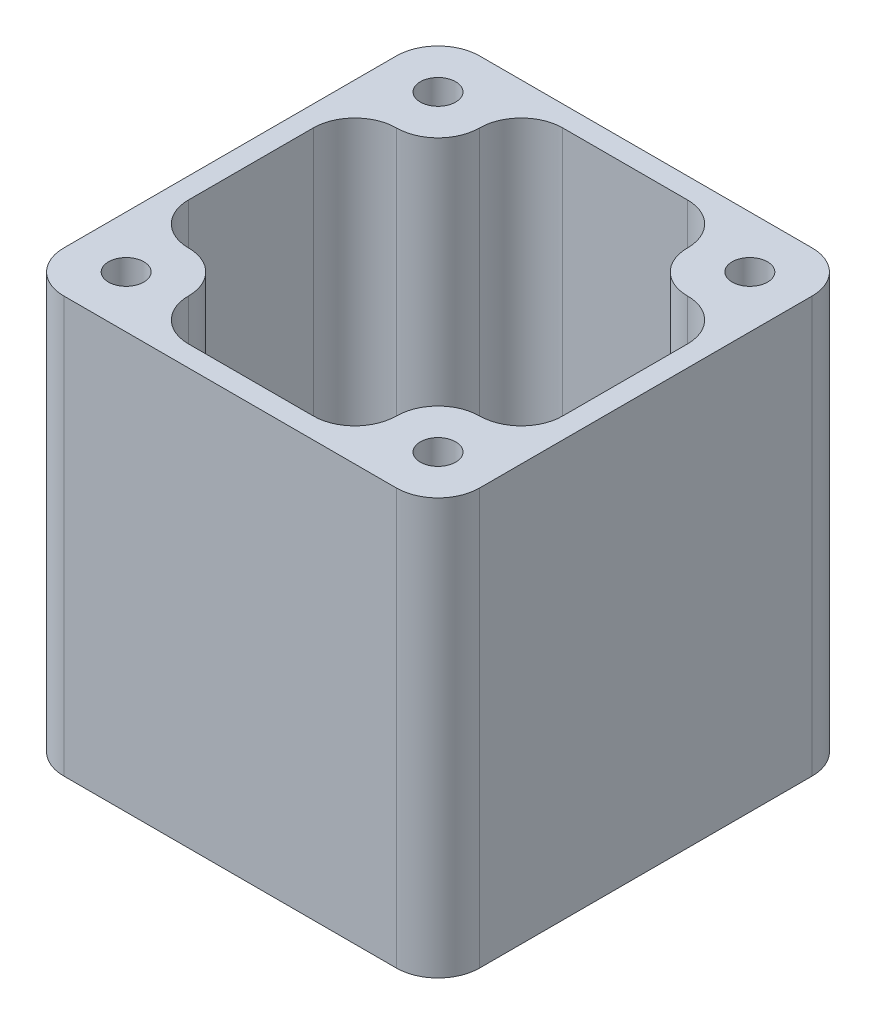
ISO-10303-21;
HEADER;
FILE_DESCRIPTION(('STEP AP214'),'2;1');
FILE_NAME('part.step','',(''),(''),'','','');
FILE_SCHEMA(('AUTOMOTIVE_DESIGN { 1 0 10303 214 1 1 1 1 }'));
ENDSEC;
DATA;
#1=APPLICATION_CONTEXT('core data for automotive mechanical design processes');
#2=APPLICATION_PROTOCOL_DEFINITION('international standard','automotive_design',2000,#1);
#3=PRODUCT_CONTEXT('',#1,'mechanical');
#4=PRODUCT('Part','Part','',(#3));
#5=PRODUCT_RELATED_PRODUCT_CATEGORY('part','',(#4));
#6=PRODUCT_DEFINITION_FORMATION('','',#4);
#7=PRODUCT_DEFINITION_CONTEXT('part definition',#1,'design');
#8=PRODUCT_DEFINITION('design','',#6,#7);
#9=PRODUCT_DEFINITION_SHAPE('','',#8);
#10=(LENGTH_UNIT() NAMED_UNIT(*) SI_UNIT(.MILLI.,.METRE.));
#11=(NAMED_UNIT(*) PLANE_ANGLE_UNIT() SI_UNIT($,.RADIAN.));
#12=(NAMED_UNIT(*) SI_UNIT($,.STERADIAN.) SOLID_ANGLE_UNIT());
#13=UNCERTAINTY_MEASURE_WITH_UNIT(LENGTH_MEASURE(1.E-05),#10,'distance_accuracy_value','');
#14=(GEOMETRIC_REPRESENTATION_CONTEXT(3) GLOBAL_UNCERTAINTY_ASSIGNED_CONTEXT((#13)) GLOBAL_UNIT_ASSIGNED_CONTEXT((#10,
#11,#12)) REPRESENTATION_CONTEXT('',''));
#15=CARTESIAN_POINT('',(0.,0.,0.));
#16=DIRECTION('',(0.,0.,1.));
#17=DIRECTION('',(1.,0.,0.));
#18=AXIS2_PLACEMENT_3D('',#15,#16,#17);
#19=CARTESIAN_POINT('',(0.,40.,0.));
#20=DIRECTION('',(0.,1.,0.));
#21=DIRECTION('',(0.,0.,1.));
#22=AXIS2_PLACEMENT_3D('',#19,#20,#21);
#23=PLANE('',#22);
#24=DIRECTION('',(1.,0.,0.));
#25=VECTOR('',#24,1.);
#26=CARTESIAN_POINT('',(-10.0000000000001,40.,18.));
#27=LINE('',#26,#25);
#28=CARTESIAN_POINT('',(-6.00000000000006,40.,18.));
#29=VERTEX_POINT('',#28);
#30=CARTESIAN_POINT('',(5.99999999999994,40.,18.));
#31=VERTEX_POINT('',#30);
#32=EDGE_CURVE('E396',#29,#31,#27,.T.);
#33=ORIENTED_EDGE('',*,*,#32,.F.);
#34=CARTESIAN_POINT('',(-6.00000000000005,40.,14.));
#35=DIRECTION('',(0.,1.,0.));
#36=DIRECTION('',(0.,0.,1.));
#37=AXIS2_PLACEMENT_3D('',#34,#35,#36);
#38=CIRCLE('',#37,4.);
#39=CARTESIAN_POINT('',(-10.,40.,14.));
#40=VERTEX_POINT('',#39);
#41=EDGE_CURVE('E372',#29,#40,#38,.F.);
#42=ORIENTED_EDGE('',*,*,#41,.T.);
#43=CARTESIAN_POINT('',(-14.,40.,14.));
#44=DIRECTION('',(0.,1.,0.));
#45=DIRECTION('',(0.,0.,1.));
#46=AXIS2_PLACEMENT_3D('',#43,#44,#45);
#47=CIRCLE('',#46,4.);
#48=CARTESIAN_POINT('',(-14.,40.,10.));
#49=VERTEX_POINT('',#48);
#50=EDGE_CURVE('E315',#40,#49,#47,.T.);
#51=ORIENTED_EDGE('',*,*,#50,.T.);
#52=CARTESIAN_POINT('',(-14.,40.,6.));
#53=DIRECTION('',(0.,1.,0.));
#54=DIRECTION('',(0.,0.,1.));
#55=AXIS2_PLACEMENT_3D('',#52,#53,#54);
#56=CIRCLE('',#55,4.);
#57=CARTESIAN_POINT('',(-18.,40.,6.));
#58=VERTEX_POINT('',#57);
#59=EDGE_CURVE('E368',#49,#58,#56,.F.);
#60=ORIENTED_EDGE('',*,*,#59,.T.);
#61=DIRECTION('',(0.,0.,1.));
#62=VECTOR('',#61,1.);
#63=CARTESIAN_POINT('',(-18.,40.,10.));
#64=LINE('',#63,#62);
#65=CARTESIAN_POINT('',(-18.,40.,-6.));
#66=VERTEX_POINT('',#65);
#67=EDGE_CURVE('E436',#66,#58,#64,.T.);
#68=ORIENTED_EDGE('',*,*,#67,.F.);
#69=CARTESIAN_POINT('',(-14.,40.,-6.));
#70=DIRECTION('',(0.,1.,0.));
#71=DIRECTION('',(0.,0.,1.));
#72=AXIS2_PLACEMENT_3D('',#69,#70,#71);
#73=CIRCLE('',#72,4.);
#74=CARTESIAN_POINT('',(-14.,40.,-10.));
#75=VERTEX_POINT('',#74);
#76=EDGE_CURVE('E102',#66,#75,#73,.F.);
#77=ORIENTED_EDGE('',*,*,#76,.T.);
#78=CARTESIAN_POINT('',(-14.,40.,-14.));
#79=DIRECTION('',(0.,1.,0.));
#80=DIRECTION('',(0.,0.,1.));
#81=AXIS2_PLACEMENT_3D('',#78,#79,#80);
#82=CIRCLE('',#81,4.);
#83=CARTESIAN_POINT('',(-9.99999999999995,40.,-14.));
#84=VERTEX_POINT('',#83);
#85=EDGE_CURVE('E309',#75,#84,#82,.T.);
#86=ORIENTED_EDGE('',*,*,#85,.T.);
#87=CARTESIAN_POINT('',(-5.99999999999995,40.,-14.));
#88=DIRECTION('',(0.,1.,0.));
#89=DIRECTION('',(0.,0.,1.));
#90=AXIS2_PLACEMENT_3D('',#87,#88,#89);
#91=CIRCLE('',#90,4.);
#92=CARTESIAN_POINT('',(-5.99999999999994,40.,-18.));
#93=VERTEX_POINT('',#92);
#94=EDGE_CURVE('E386',#84,#93,#91,.F.);
#95=ORIENTED_EDGE('',*,*,#94,.T.);
#96=DIRECTION('',(-1.,0.,0.));
#97=VECTOR('',#96,1.);
#98=CARTESIAN_POINT('',(-9.99999999999994,40.,-18.));
#99=LINE('',#98,#97);
#100=CARTESIAN_POINT('',(6.00000000000006,40.,-18.));
#101=VERTEX_POINT('',#100);
#102=EDGE_CURVE('E830',#101,#93,#99,.T.);
#103=ORIENTED_EDGE('',*,*,#102,.F.);
#104=CARTESIAN_POINT('',(6.00000000000005,40.,-14.));
#105=DIRECTION('',(0.,1.,0.));
#106=DIRECTION('',(0.,0.,1.));
#107=AXIS2_PLACEMENT_3D('',#104,#105,#106);
#108=CIRCLE('',#107,4.);
#109=CARTESIAN_POINT('',(10.,40.,-14.));
#110=VERTEX_POINT('',#109);
#111=EDGE_CURVE('E384',#101,#110,#108,.F.);
#112=ORIENTED_EDGE('',*,*,#111,.T.);
#113=CARTESIAN_POINT('',(14.,40.,-14.));
#114=DIRECTION('',(0.,1.,0.));
#115=DIRECTION('',(0.,0.,1.));
#116=AXIS2_PLACEMENT_3D('',#113,#114,#115);
#117=CIRCLE('',#116,4.);
#118=CARTESIAN_POINT('',(14.,40.,-10.));
#119=VERTEX_POINT('',#118);
#120=EDGE_CURVE('E311',#110,#119,#117,.T.);
#121=ORIENTED_EDGE('',*,*,#120,.T.);
#122=CARTESIAN_POINT('',(14.,40.,-6.));
#123=DIRECTION('',(0.,1.,0.));
#124=DIRECTION('',(0.,0.,1.));
#125=AXIS2_PLACEMENT_3D('',#122,#123,#124);
#126=CIRCLE('',#125,4.);
#127=CARTESIAN_POINT('',(18.,40.,-6.));
#128=VERTEX_POINT('',#127);
#129=EDGE_CURVE('E380',#119,#128,#126,.F.);
#130=ORIENTED_EDGE('',*,*,#129,.T.);
#131=DIRECTION('',(0.,0.,-1.));
#132=VECTOR('',#131,1.);
#133=CARTESIAN_POINT('',(18.,40.,10.));
#134=LINE('',#133,#132);
#135=CARTESIAN_POINT('',(18.,40.,6.));
#136=VERTEX_POINT('',#135);
#137=EDGE_CURVE('E440',#136,#128,#134,.T.);
#138=ORIENTED_EDGE('',*,*,#137,.F.);
#139=CARTESIAN_POINT('',(14.,40.,6.));
#140=DIRECTION('',(0.,1.,0.));
#141=DIRECTION('',(0.,0.,1.));
#142=AXIS2_PLACEMENT_3D('',#139,#140,#141);
#143=CIRCLE('',#142,4.);
#144=CARTESIAN_POINT('',(14.,40.,10.));
#145=VERTEX_POINT('',#144);
#146=EDGE_CURVE('E378',#136,#145,#143,.F.);
#147=ORIENTED_EDGE('',*,*,#146,.T.);
#148=CARTESIAN_POINT('',(14.,40.,14.));
#149=DIRECTION('',(0.,1.,0.));
#150=DIRECTION('',(0.,0.,1.));
#151=AXIS2_PLACEMENT_3D('',#148,#149,#150);
#152=CIRCLE('',#151,4.);
#153=CARTESIAN_POINT('',(9.99999999999995,40.,14.));
#154=VERTEX_POINT('',#153);
#155=EDGE_CURVE('E313',#145,#154,#152,.T.);
#156=ORIENTED_EDGE('',*,*,#155,.T.);
#157=CARTESIAN_POINT('',(5.99999999999995,40.,14.));
#158=DIRECTION('',(0.,1.,0.));
#159=DIRECTION('',(0.,0.,1.));
#160=AXIS2_PLACEMENT_3D('',#157,#158,#159);
#161=CIRCLE('',#160,4.);
#162=EDGE_CURVE('E374',#154,#31,#161,.F.);
#163=ORIENTED_EDGE('',*,*,#162,.T.);
#164=EDGE_LOOP('',(#33,#42,#51,#60,#68,#77,#86,#95,#103,#112,#121,#130,#138,#147,#156,#163));
#165=FACE_BOUND('',#164,.T.);
#166=CARTESIAN_POINT('',(-15.,40.,15.));
#167=DIRECTION('',(0.,1.,0.));
#168=DIRECTION('',(0.,0.,1.));
#169=AXIS2_PLACEMENT_3D('',#166,#167,#168);
#170=CIRCLE('',#169,1.7);
#171=CARTESIAN_POINT('',(-15.,40.,16.7));
#172=VERTEX_POINT('',#171);
#173=EDGE_CURVE('E448',#172,#172,#170,.T.);
#174=ORIENTED_EDGE('',*,*,#173,.F.);
#175=EDGE_LOOP('',(#174));
#176=FACE_BOUND('',#175,.T.);
#177=CARTESIAN_POINT('',(-15.,40.,-15.));
#178=DIRECTION('',(0.,1.,0.));
#179=DIRECTION('',(0.,0.,1.));
#180=AXIS2_PLACEMENT_3D('',#177,#178,#179);
#181=CIRCLE('',#180,1.7);
#182=CARTESIAN_POINT('',(-15.,40.,-13.3));
#183=VERTEX_POINT('',#182);
#184=EDGE_CURVE('E285',#183,#183,#181,.T.);
#185=ORIENTED_EDGE('',*,*,#184,.F.);
#186=EDGE_LOOP('',(#185));
#187=FACE_BOUND('',#186,.T.);
#188=DIRECTION('',(1.,0.,0.));
#189=VECTOR('',#188,1.);
#190=CARTESIAN_POINT('',(-20.,40.,-20.));
#191=LINE('',#190,#189);
#192=CARTESIAN_POINT('',(-16.,40.,-20.));
#193=VERTEX_POINT('',#192);
#194=CARTESIAN_POINT('',(16.,40.,-20.));
#195=VERTEX_POINT('',#194);
#196=EDGE_CURVE('E294',#193,#195,#191,.T.);
#197=ORIENTED_EDGE('',*,*,#196,.F.);
#198=CARTESIAN_POINT('',(-16.,40.,-16.));
#199=DIRECTION('',(0.,1.,0.));
#200=DIRECTION('',(0.,0.,1.));
#201=AXIS2_PLACEMENT_3D('',#198,#199,#200);
#202=CIRCLE('',#201,4.);
#203=CARTESIAN_POINT('',(-20.,40.,-16.));
#204=VERTEX_POINT('',#203);
#205=EDGE_CURVE('E323',#193,#204,#202,.T.);
#206=ORIENTED_EDGE('',*,*,#205,.T.);
#207=DIRECTION('',(0.,0.,1.));
#208=VECTOR('',#207,1.);
#209=CARTESIAN_POINT('',(-20.,40.,-20.));
#210=LINE('',#209,#208);
#211=CARTESIAN_POINT('',(-20.,40.,16.));
#212=VERTEX_POINT('',#211);
#213=EDGE_CURVE('E277',#204,#212,#210,.T.);
#214=ORIENTED_EDGE('',*,*,#213,.T.);
#215=CARTESIAN_POINT('',(-16.,40.,16.));
#216=DIRECTION('',(0.,1.,0.));
#217=DIRECTION('',(0.,0.,1.));
#218=AXIS2_PLACEMENT_3D('',#215,#216,#217);
#219=CIRCLE('',#218,4.);
#220=CARTESIAN_POINT('',(-16.,40.,20.));
#221=VERTEX_POINT('',#220);
#222=EDGE_CURVE('E317',#212,#221,#219,.T.);
#223=ORIENTED_EDGE('',*,*,#222,.T.);
#224=DIRECTION('',(1.,0.,0.));
#225=VECTOR('',#224,1.);
#226=CARTESIAN_POINT('',(-20.,40.,20.));
#227=LINE('',#226,#225);
#228=CARTESIAN_POINT('',(16.,40.,20.));
#229=VERTEX_POINT('',#228);
#230=EDGE_CURVE('E462',#221,#229,#227,.T.);
#231=ORIENTED_EDGE('',*,*,#230,.T.);
#232=CARTESIAN_POINT('',(16.,40.,16.));
#233=DIRECTION('',(0.,1.,0.));
#234=DIRECTION('',(0.,0.,1.));
#235=AXIS2_PLACEMENT_3D('',#232,#233,#234);
#236=CIRCLE('',#235,4.);
#237=CARTESIAN_POINT('',(20.,40.,16.));
#238=VERTEX_POINT('',#237);
#239=EDGE_CURVE('E319',#229,#238,#236,.T.);
#240=ORIENTED_EDGE('',*,*,#239,.T.);
#241=DIRECTION('',(0.,0.,1.));
#242=VECTOR('',#241,1.);
#243=CARTESIAN_POINT('',(20.,40.,-20.));
#244=LINE('',#243,#242);
#245=CARTESIAN_POINT('',(20.,40.,-16.));
#246=VERTEX_POINT('',#245);
#247=EDGE_CURVE('E464',#246,#238,#244,.T.);
#248=ORIENTED_EDGE('',*,*,#247,.F.);
#249=CARTESIAN_POINT('',(16.,40.,-16.));
#250=DIRECTION('',(0.,1.,0.));
#251=DIRECTION('',(0.,0.,1.));
#252=AXIS2_PLACEMENT_3D('',#249,#250,#251);
#253=CIRCLE('',#252,4.);
#254=EDGE_CURVE('E321',#246,#195,#253,.T.);
#255=ORIENTED_EDGE('',*,*,#254,.T.);
#256=EDGE_LOOP('',(#197,#206,#214,#223,#231,#240,#248,#255));
#257=FACE_BOUND('',#256,.T.);
#258=CARTESIAN_POINT('',(15.,40.,-15.));
#259=DIRECTION('',(0.,1.,0.));
#260=DIRECTION('',(0.,0.,1.));
#261=AXIS2_PLACEMENT_3D('',#258,#259,#260);
#262=CIRCLE('',#261,1.7);
#263=CARTESIAN_POINT('',(15.,40.,-13.3));
#264=VERTEX_POINT('',#263);
#265=EDGE_CURVE('E454',#264,#264,#262,.T.);
#266=ORIENTED_EDGE('',*,*,#265,.F.);
#267=EDGE_LOOP('',(#266));
#268=FACE_BOUND('',#267,.T.);
#269=CARTESIAN_POINT('',(15.,40.,15.));
#270=DIRECTION('',(0.,1.,0.));
#271=DIRECTION('',(0.,0.,1.));
#272=AXIS2_PLACEMENT_3D('',#269,#270,#271);
#273=CIRCLE('',#272,1.7);
#274=CARTESIAN_POINT('',(15.,40.,16.7));
#275=VERTEX_POINT('',#274);
#276=EDGE_CURVE('E434',#275,#275,#273,.T.);
#277=ORIENTED_EDGE('',*,*,#276,.F.);
#278=EDGE_LOOP('',(#277));
#279=FACE_BOUND('',#278,.T.);
#280=ADVANCED_FACE('F93',(#165,#176,#187,#257,#268,#279),#23,.T.);
#281=CARTESIAN_POINT('',(0.,0.,0.));
#282=DIRECTION('',(0.,1.,0.));
#283=DIRECTION('',(0.,0.,1.));
#284=AXIS2_PLACEMENT_3D('',#281,#282,#283);
#285=PLANE('',#284);
#286=DIRECTION('',(0.,0.,1.));
#287=VECTOR('',#286,1.);
#288=CARTESIAN_POINT('',(-20.,0.,-20.));
#289=LINE('',#288,#287);
#290=CARTESIAN_POINT('',(-20.,0.,-16.));
#291=VERTEX_POINT('',#290);
#292=CARTESIAN_POINT('',(-20.,0.,16.));
#293=VERTEX_POINT('',#292);
#294=EDGE_CURVE('E274',#291,#293,#289,.T.);
#295=ORIENTED_EDGE('',*,*,#294,.F.);
#296=CARTESIAN_POINT('',(-16.,0.,-16.));
#297=DIRECTION('',(0.,1.,0.));
#298=DIRECTION('',(0.,0.,1.));
#299=AXIS2_PLACEMENT_3D('',#296,#297,#298);
#300=CIRCLE('',#299,4.);
#301=CARTESIAN_POINT('',(-16.,0.,-20.));
#302=VERTEX_POINT('',#301);
#303=EDGE_CURVE('E257',#291,#302,#300,.F.);
#304=ORIENTED_EDGE('',*,*,#303,.T.);
#305=DIRECTION('',(1.,0.,0.));
#306=VECTOR('',#305,1.);
#307=CARTESIAN_POINT('',(-20.,0.,-20.));
#308=LINE('',#307,#306);
#309=CARTESIAN_POINT('',(16.,0.,-20.));
#310=VERTEX_POINT('',#309);
#311=EDGE_CURVE('E299',#302,#310,#308,.T.);
#312=ORIENTED_EDGE('',*,*,#311,.T.);
#313=CARTESIAN_POINT('',(16.,0.,-16.));
#314=DIRECTION('',(0.,1.,0.));
#315=DIRECTION('',(0.,0.,1.));
#316=AXIS2_PLACEMENT_3D('',#313,#314,#315);
#317=CIRCLE('',#316,4.);
#318=CARTESIAN_POINT('',(20.,0.,-16.));
#319=VERTEX_POINT('',#318);
#320=EDGE_CURVE('E268',#310,#319,#317,.F.);
#321=ORIENTED_EDGE('',*,*,#320,.T.);
#322=DIRECTION('',(0.,0.,1.));
#323=VECTOR('',#322,1.);
#324=CARTESIAN_POINT('',(20.,0.,-20.));
#325=LINE('',#324,#323);
#326=CARTESIAN_POINT('',(20.,0.,16.));
#327=VERTEX_POINT('',#326);
#328=EDGE_CURVE('E288',#319,#327,#325,.T.);
#329=ORIENTED_EDGE('',*,*,#328,.T.);
#330=CARTESIAN_POINT('',(16.,0.,16.));
#331=DIRECTION('',(0.,1.,0.));
#332=DIRECTION('',(0.,0.,1.));
#333=AXIS2_PLACEMENT_3D('',#330,#331,#332);
#334=CIRCLE('',#333,4.);
#335=CARTESIAN_POINT('',(16.,0.,20.));
#336=VERTEX_POINT('',#335);
#337=EDGE_CURVE('E303',#327,#336,#334,.F.);
#338=ORIENTED_EDGE('',*,*,#337,.T.);
#339=DIRECTION('',(1.,0.,0.));
#340=VECTOR('',#339,1.);
#341=CARTESIAN_POINT('',(-20.,0.,20.));
#342=LINE('',#341,#340);
#343=CARTESIAN_POINT('',(-16.,0.,20.));
#344=VERTEX_POINT('',#343);
#345=EDGE_CURVE('E284',#344,#336,#342,.T.);
#346=ORIENTED_EDGE('',*,*,#345,.F.);
#347=CARTESIAN_POINT('',(-16.,0.,16.));
#348=DIRECTION('',(0.,1.,0.));
#349=DIRECTION('',(0.,0.,1.));
#350=AXIS2_PLACEMENT_3D('',#347,#348,#349);
#351=CIRCLE('',#350,4.);
#352=EDGE_CURVE('E278',#344,#293,#351,.F.);
#353=ORIENTED_EDGE('',*,*,#352,.T.);
#354=EDGE_LOOP('',(#295,#304,#312,#321,#329,#338,#346,#353));
#355=FACE_BOUND('',#354,.T.);
#356=CARTESIAN_POINT('',(-15.,0.,-15.));
#357=DIRECTION('',(0.,1.,0.));
#358=DIRECTION('',(0.,0.,1.));
#359=AXIS2_PLACEMENT_3D('',#356,#357,#358);
#360=CIRCLE('',#359,1.7);
#361=CARTESIAN_POINT('',(-15.,0.,-13.3));
#362=VERTEX_POINT('',#361);
#363=EDGE_CURVE('E291',#362,#362,#360,.T.);
#364=ORIENTED_EDGE('',*,*,#363,.T.);
#365=EDGE_LOOP('',(#364));
#366=FACE_BOUND('',#365,.T.);
#367=CARTESIAN_POINT('',(15.,0.,-15.));
#368=DIRECTION('',(0.,1.,0.));
#369=DIRECTION('',(0.,0.,1.));
#370=AXIS2_PLACEMENT_3D('',#367,#368,#369);
#371=CIRCLE('',#370,1.7);
#372=CARTESIAN_POINT('',(15.,0.,-13.3));
#373=VERTEX_POINT('',#372);
#374=EDGE_CURVE('E451',#373,#373,#371,.T.);
#375=ORIENTED_EDGE('',*,*,#374,.T.);
#376=EDGE_LOOP('',(#375));
#377=FACE_BOUND('',#376,.T.);
#378=CARTESIAN_POINT('',(-15.,0.,15.));
#379=DIRECTION('',(0.,1.,0.));
#380=DIRECTION('',(0.,0.,1.));
#381=AXIS2_PLACEMENT_3D('',#378,#379,#380);
#382=CIRCLE('',#381,1.7);
#383=CARTESIAN_POINT('',(-15.,0.,16.7));
#384=VERTEX_POINT('',#383);
#385=EDGE_CURVE('E446',#384,#384,#382,.T.);
#386=ORIENTED_EDGE('',*,*,#385,.T.);
#387=EDGE_LOOP('',(#386));
#388=FACE_BOUND('',#387,.T.);
#389=CARTESIAN_POINT('',(15.,0.,15.));
#390=DIRECTION('',(0.,1.,0.));
#391=DIRECTION('',(0.,0.,1.));
#392=AXIS2_PLACEMENT_3D('',#389,#390,#391);
#393=CIRCLE('',#392,1.7);
#394=CARTESIAN_POINT('',(15.,0.,16.7));
#395=VERTEX_POINT('',#394);
#396=EDGE_CURVE('E430',#395,#395,#393,.T.);
#397=ORIENTED_EDGE('',*,*,#396,.T.);
#398=EDGE_LOOP('',(#397));
#399=FACE_BOUND('',#398,.T.);
#400=ADVANCED_FACE('F281',(#355,#366,#377,#388,#399),#285,.F.);
#401=CARTESIAN_POINT('',(-20.,40.,-20.));
#402=DIRECTION('',(1.,0.,0.));
#403=DIRECTION('',(0.,0.,-1.));
#404=AXIS2_PLACEMENT_3D('',#401,#402,#403);
#405=PLANE('',#404);
#406=ORIENTED_EDGE('',*,*,#213,.F.);
#407=DIRECTION('',(0.,-1.,0.));
#408=VECTOR('',#407,1.);
#409=CARTESIAN_POINT('',(-20.,0.,-16.));
#410=LINE('',#409,#408);
#411=EDGE_CURVE('E261',#204,#291,#410,.T.);
#412=ORIENTED_EDGE('',*,*,#411,.T.);
#413=ORIENTED_EDGE('',*,*,#294,.T.);
#414=DIRECTION('',(0.,-1.,0.));
#415=VECTOR('',#414,1.);
#416=CARTESIAN_POINT('',(-20.,40.,16.));
#417=LINE('',#416,#415);
#418=EDGE_CURVE('E279',#293,#212,#417,.F.);
#419=ORIENTED_EDGE('',*,*,#418,.T.);
#420=EDGE_LOOP('',(#406,#412,#413,#419));
#421=FACE_BOUND('',#420,.T.);
#422=ADVANCED_FACE('F273',(#421),#405,.F.);
#423=CARTESIAN_POINT('',(-20.,40.,20.));
#424=DIRECTION('',(0.,0.,-1.));
#425=DIRECTION('',(-1.,0.,0.));
#426=AXIS2_PLACEMENT_3D('',#423,#424,#425);
#427=PLANE('',#426);
#428=ORIENTED_EDGE('',*,*,#345,.T.);
#429=DIRECTION('',(0.,-1.,0.));
#430=VECTOR('',#429,1.);
#431=CARTESIAN_POINT('',(16.,40.,20.));
#432=LINE('',#431,#430);
#433=EDGE_CURVE('E333',#336,#229,#432,.F.);
#434=ORIENTED_EDGE('',*,*,#433,.T.);
#435=ORIENTED_EDGE('',*,*,#230,.F.);
#436=DIRECTION('',(0.,-1.,0.));
#437=VECTOR('',#436,1.);
#438=CARTESIAN_POINT('',(-16.,40.,20.));
#439=LINE('',#438,#437);
#440=EDGE_CURVE('E330',#221,#344,#439,.T.);
#441=ORIENTED_EDGE('',*,*,#440,.T.);
#442=EDGE_LOOP('',(#428,#434,#435,#441));
#443=FACE_BOUND('',#442,.T.);
#444=ADVANCED_FACE('F486',(#443),#427,.F.);
#445=CARTESIAN_POINT('',(20.,40.,-20.));
#446=DIRECTION('',(1.,0.,0.));
#447=DIRECTION('',(0.,0.,-1.));
#448=AXIS2_PLACEMENT_3D('',#445,#446,#447);
#449=PLANE('',#448);
#450=ORIENTED_EDGE('',*,*,#328,.F.);
#451=DIRECTION('',(0.,-1.,0.));
#452=VECTOR('',#451,1.);
#453=CARTESIAN_POINT('',(20.,40.,-16.));
#454=LINE('',#453,#452);
#455=EDGE_CURVE('E328',#319,#246,#454,.F.);
#456=ORIENTED_EDGE('',*,*,#455,.T.);
#457=ORIENTED_EDGE('',*,*,#247,.T.);
#458=DIRECTION('',(0.,-1.,0.));
#459=VECTOR('',#458,1.);
#460=CARTESIAN_POINT('',(20.,0.,16.));
#461=LINE('',#460,#459);
#462=EDGE_CURVE('E325',#238,#327,#461,.T.);
#463=ORIENTED_EDGE('',*,*,#462,.T.);
#464=EDGE_LOOP('',(#450,#456,#457,#463));
#465=FACE_BOUND('',#464,.T.);
#466=ADVANCED_FACE('F480',(#465),#449,.T.);
#467=CARTESIAN_POINT('',(-20.,40.,-20.));
#468=DIRECTION('',(0.,0.,-1.));
#469=DIRECTION('',(-1.,0.,0.));
#470=AXIS2_PLACEMENT_3D('',#467,#468,#469);
#471=PLANE('',#470);
#472=ORIENTED_EDGE('',*,*,#311,.F.);
#473=DIRECTION('',(0.,-1.,0.));
#474=VECTOR('',#473,1.);
#475=CARTESIAN_POINT('',(-16.,40.,-20.));
#476=LINE('',#475,#474);
#477=EDGE_CURVE('E262',#302,#193,#476,.F.);
#478=ORIENTED_EDGE('',*,*,#477,.T.);
#479=ORIENTED_EDGE('',*,*,#196,.T.);
#480=DIRECTION('',(0.,-1.,0.));
#481=VECTOR('',#480,1.);
#482=CARTESIAN_POINT('',(16.,40.,-20.));
#483=LINE('',#482,#481);
#484=EDGE_CURVE('E267',#195,#310,#483,.T.);
#485=ORIENTED_EDGE('',*,*,#484,.T.);
#486=EDGE_LOOP('',(#472,#478,#479,#485));
#487=FACE_BOUND('',#486,.T.);
#488=ADVANCED_FACE('F473',(#487),#471,.T.);
#489=CARTESIAN_POINT('',(-15.,40.,-15.));
#490=DIRECTION('',(0.,-1.,0.));
#491=DIRECTION('',(0.,0.,-1.));
#492=AXIS2_PLACEMENT_3D('',#489,#490,#491);
#493=CYLINDRICAL_SURFACE('',#492,1.7);
#494=ORIENTED_EDGE('',*,*,#184,.T.);
#495=EDGE_LOOP('',(#494));
#496=FACE_BOUND('',#495,.T.);
#497=ORIENTED_EDGE('',*,*,#363,.F.);
#498=EDGE_LOOP('',(#497));
#499=FACE_BOUND('',#498,.T.);
#500=ADVANCED_FACE('F518',(#496,#499),#493,.F.);
#501=CARTESIAN_POINT('',(15.,40.,-15.));
#502=DIRECTION('',(0.,-1.,0.));
#503=DIRECTION('',(0.,0.,-1.));
#504=AXIS2_PLACEMENT_3D('',#501,#502,#503);
#505=CYLINDRICAL_SURFACE('',#504,1.7);
#506=ORIENTED_EDGE('',*,*,#265,.T.);
#507=EDGE_LOOP('',(#506));
#508=FACE_BOUND('',#507,.T.);
#509=ORIENTED_EDGE('',*,*,#374,.F.);
#510=EDGE_LOOP('',(#509));
#511=FACE_BOUND('',#510,.T.);
#512=ADVANCED_FACE('F673',(#508,#511),#505,.F.);
#513=CARTESIAN_POINT('',(-15.,40.,15.));
#514=DIRECTION('',(0.,-1.,0.));
#515=DIRECTION('',(0.,0.,-1.));
#516=AXIS2_PLACEMENT_3D('',#513,#514,#515);
#517=CYLINDRICAL_SURFACE('',#516,1.7);
#518=ORIENTED_EDGE('',*,*,#173,.T.);
#519=EDGE_LOOP('',(#518));
#520=FACE_BOUND('',#519,.T.);
#521=ORIENTED_EDGE('',*,*,#385,.F.);
#522=EDGE_LOOP('',(#521));
#523=FACE_BOUND('',#522,.T.);
#524=ADVANCED_FACE('F504',(#520,#523),#517,.F.);
#525=CARTESIAN_POINT('',(15.,40.,15.));
#526=DIRECTION('',(0.,-1.,0.));
#527=DIRECTION('',(0.,0.,-1.));
#528=AXIS2_PLACEMENT_3D('',#525,#526,#527);
#529=CYLINDRICAL_SURFACE('',#528,1.7);
#530=ORIENTED_EDGE('',*,*,#276,.T.);
#531=EDGE_LOOP('',(#530));
#532=FACE_BOUND('',#531,.T.);
#533=ORIENTED_EDGE('',*,*,#396,.F.);
#534=EDGE_LOOP('',(#533));
#535=FACE_BOUND('',#534,.T.);
#536=ADVANCED_FACE('F500',(#532,#535),#529,.F.);
#537=CARTESIAN_POINT('',(18.,2.,10.));
#538=DIRECTION('',(1.,0.,0.));
#539=DIRECTION('',(0.,0.,-1.));
#540=AXIS2_PLACEMENT_3D('',#537,#538,#539);
#541=PLANE('',#540);
#542=DIRECTION('',(0.,0.,-1.));
#543=VECTOR('',#542,1.);
#544=CARTESIAN_POINT('',(18.,2.,10.));
#545=LINE('',#544,#543);
#546=CARTESIAN_POINT('',(18.,2.,6.));
#547=VERTEX_POINT('',#546);
#548=CARTESIAN_POINT('',(18.,2.,-6.));
#549=VERTEX_POINT('',#548);
#550=EDGE_CURVE('E431',#547,#549,#545,.T.);
#551=ORIENTED_EDGE('',*,*,#550,.F.);
#552=DIRECTION('',(0.,1.,0.));
#553=VECTOR('',#552,1.);
#554=CARTESIAN_POINT('',(18.,40.,6.));
#555=LINE('',#554,#553);
#556=EDGE_CURVE('E361',#547,#136,#555,.T.);
#557=ORIENTED_EDGE('',*,*,#556,.T.);
#558=ORIENTED_EDGE('',*,*,#137,.T.);
#559=DIRECTION('',(0.,1.,0.));
#560=VECTOR('',#559,1.);
#561=CARTESIAN_POINT('',(18.,2.,-6.));
#562=LINE('',#561,#560);
#563=EDGE_CURVE('E359',#128,#549,#562,.F.);
#564=ORIENTED_EDGE('',*,*,#563,.T.);
#565=EDGE_LOOP('',(#551,#557,#558,#564));
#566=FACE_BOUND('',#565,.T.);
#567=ADVANCED_FACE('F503',(#566),#541,.F.);
#568=CARTESIAN_POINT('',(-18.,2.,10.));
#569=DIRECTION('',(-1.,0.,0.));
#570=DIRECTION('',(0.,0.,1.));
#571=AXIS2_PLACEMENT_3D('',#568,#569,#570);
#572=PLANE('',#571);
#573=ORIENTED_EDGE('',*,*,#67,.T.);
#574=DIRECTION('',(0.,1.,0.));
#575=VECTOR('',#574,1.);
#576=CARTESIAN_POINT('',(-18.,2.,6.));
#577=LINE('',#576,#575);
#578=CARTESIAN_POINT('',(-18.,2.,6.));
#579=VERTEX_POINT('',#578);
#580=EDGE_CURVE('E337',#58,#579,#577,.F.);
#581=ORIENTED_EDGE('',*,*,#580,.T.);
#582=DIRECTION('',(0.,0.,1.));
#583=VECTOR('',#582,1.);
#584=CARTESIAN_POINT('',(-18.,2.,10.));
#585=LINE('',#584,#583);
#586=CARTESIAN_POINT('',(-18.,2.,-6.));
#587=VERTEX_POINT('',#586);
#588=EDGE_CURVE('E424',#587,#579,#585,.T.);
#589=ORIENTED_EDGE('',*,*,#588,.F.);
#590=DIRECTION('',(0.,1.,0.));
#591=VECTOR('',#590,1.);
#592=CARTESIAN_POINT('',(-18.,40.,-6.));
#593=LINE('',#592,#591);
#594=EDGE_CURVE('E335',#587,#66,#593,.T.);
#595=ORIENTED_EDGE('',*,*,#594,.T.);
#596=EDGE_LOOP('',(#573,#581,#589,#595));
#597=FACE_BOUND('',#596,.T.);
#598=ADVANCED_FACE('F427',(#597),#572,.F.);
#599=CARTESIAN_POINT('',(0.,2.,0.));
#600=DIRECTION('',(0.,-1.,0.));
#601=DIRECTION('',(0.,0.,-1.));
#602=AXIS2_PLACEMENT_3D('',#599,#600,#601);
#603=PLANE('',#602);
#604=ORIENTED_EDGE('',*,*,#588,.T.);
#605=CARTESIAN_POINT('',(-14.,2.,6.));
#606=DIRECTION('',(0.,-1.,0.));
#607=DIRECTION('',(0.,0.,-1.));
#608=AXIS2_PLACEMENT_3D('',#605,#606,#607);
#609=CIRCLE('',#608,4.);
#610=CARTESIAN_POINT('',(-14.,2.,10.));
#611=VERTEX_POINT('',#610);
#612=EDGE_CURVE('E352',#579,#611,#609,.F.);
#613=ORIENTED_EDGE('',*,*,#612,.T.);
#614=CARTESIAN_POINT('',(-14.,2.,14.));
#615=DIRECTION('',(0.,-1.,0.));
#616=DIRECTION('',(0.,0.,-1.));
#617=AXIS2_PLACEMENT_3D('',#614,#615,#616);
#618=CIRCLE('',#617,4.);
#619=CARTESIAN_POINT('',(-10.,2.,14.));
#620=VERTEX_POINT('',#619);
#621=EDGE_CURVE('E370',#611,#620,#618,.T.);
#622=ORIENTED_EDGE('',*,*,#621,.T.);
#623=CARTESIAN_POINT('',(-6.00000000000005,2.,14.));
#624=DIRECTION('',(0.,-1.,0.));
#625=DIRECTION('',(0.,0.,-1.));
#626=AXIS2_PLACEMENT_3D('',#623,#624,#625);
#627=CIRCLE('',#626,4.);
#628=CARTESIAN_POINT('',(-6.00000000000006,2.,18.));
#629=VERTEX_POINT('',#628);
#630=EDGE_CURVE('E350',#620,#629,#627,.F.);
#631=ORIENTED_EDGE('',*,*,#630,.T.);
#632=DIRECTION('',(1.,0.,0.));
#633=VECTOR('',#632,1.);
#634=CARTESIAN_POINT('',(-10.0000000000001,2.,18.));
#635=LINE('',#634,#633);
#636=CARTESIAN_POINT('',(5.99999999999994,2.,18.));
#637=VERTEX_POINT('',#636);
#638=EDGE_CURVE('E832',#629,#637,#635,.T.);
#639=ORIENTED_EDGE('',*,*,#638,.T.);
#640=CARTESIAN_POINT('',(5.99999999999995,2.,14.));
#641=DIRECTION('',(0.,-1.,0.));
#642=DIRECTION('',(0.,0.,-1.));
#643=AXIS2_PLACEMENT_3D('',#640,#641,#642);
#644=CIRCLE('',#643,4.);
#645=CARTESIAN_POINT('',(9.99999999999995,2.,14.));
#646=VERTEX_POINT('',#645);
#647=EDGE_CURVE('E348',#637,#646,#644,.F.);
#648=ORIENTED_EDGE('',*,*,#647,.T.);
#649=CARTESIAN_POINT('',(14.,2.,14.));
#650=DIRECTION('',(0.,-1.,0.));
#651=DIRECTION('',(0.,0.,-1.));
#652=AXIS2_PLACEMENT_3D('',#649,#650,#651);
#653=CIRCLE('',#652,4.);
#654=CARTESIAN_POINT('',(14.,2.,10.));
#655=VERTEX_POINT('',#654);
#656=EDGE_CURVE('E376',#646,#655,#653,.T.);
#657=ORIENTED_EDGE('',*,*,#656,.T.);
#658=CARTESIAN_POINT('',(14.,2.,6.));
#659=DIRECTION('',(0.,-1.,0.));
#660=DIRECTION('',(0.,0.,-1.));
#661=AXIS2_PLACEMENT_3D('',#658,#659,#660);
#662=CIRCLE('',#661,4.);
#663=EDGE_CURVE('E118',#655,#547,#662,.F.);
#664=ORIENTED_EDGE('',*,*,#663,.T.);
#665=ORIENTED_EDGE('',*,*,#550,.T.);
#666=CARTESIAN_POINT('',(14.,2.,-6.));
#667=DIRECTION('',(0.,-1.,0.));
#668=DIRECTION('',(0.,0.,-1.));
#669=AXIS2_PLACEMENT_3D('',#666,#667,#668);
#670=CIRCLE('',#669,4.);
#671=CARTESIAN_POINT('',(14.,2.,-10.));
#672=VERTEX_POINT('',#671);
#673=EDGE_CURVE('E110',#549,#672,#670,.F.);
#674=ORIENTED_EDGE('',*,*,#673,.T.);
#675=CARTESIAN_POINT('',(14.,2.,-14.));
#676=DIRECTION('',(0.,-1.,0.));
#677=DIRECTION('',(0.,0.,-1.));
#678=AXIS2_PLACEMENT_3D('',#675,#676,#677);
#679=CIRCLE('',#678,4.);
#680=CARTESIAN_POINT('',(10.,2.,-14.));
#681=VERTEX_POINT('',#680);
#682=EDGE_CURVE('E382',#672,#681,#679,.T.);
#683=ORIENTED_EDGE('',*,*,#682,.T.);
#684=CARTESIAN_POINT('',(6.00000000000005,2.,-14.));
#685=DIRECTION('',(0.,-1.,0.));
#686=DIRECTION('',(0.,0.,-1.));
#687=AXIS2_PLACEMENT_3D('',#684,#685,#686);
#688=CIRCLE('',#687,4.);
#689=CARTESIAN_POINT('',(6.00000000000006,2.,-18.));
#690=VERTEX_POINT('',#689);
#691=EDGE_CURVE('E344',#681,#690,#688,.F.);
#692=ORIENTED_EDGE('',*,*,#691,.T.);
#693=DIRECTION('',(-1.,0.,0.));
#694=VECTOR('',#693,1.);
#695=CARTESIAN_POINT('',(-9.99999999999994,2.,-18.));
#696=LINE('',#695,#694);
#697=CARTESIAN_POINT('',(-5.99999999999994,2.,-18.));
#698=VERTEX_POINT('',#697);
#699=EDGE_CURVE('E443',#690,#698,#696,.T.);
#700=ORIENTED_EDGE('',*,*,#699,.T.);
#701=CARTESIAN_POINT('',(-5.99999999999995,2.,-14.));
#702=DIRECTION('',(0.,-1.,0.));
#703=DIRECTION('',(0.,0.,-1.));
#704=AXIS2_PLACEMENT_3D('',#701,#702,#703);
#705=CIRCLE('',#704,4.);
#706=CARTESIAN_POINT('',(-9.99999999999995,2.,-14.));
#707=VERTEX_POINT('',#706);
#708=EDGE_CURVE('E342',#698,#707,#705,.F.);
#709=ORIENTED_EDGE('',*,*,#708,.T.);
#710=CARTESIAN_POINT('',(-14.,2.,-14.));
#711=DIRECTION('',(0.,-1.,0.));
#712=DIRECTION('',(0.,0.,-1.));
#713=AXIS2_PLACEMENT_3D('',#710,#711,#712);
#714=CIRCLE('',#713,4.);
#715=CARTESIAN_POINT('',(-14.,2.,-10.));
#716=VERTEX_POINT('',#715);
#717=EDGE_CURVE('E12',#707,#716,#714,.T.);
#718=ORIENTED_EDGE('',*,*,#717,.T.);
#719=CARTESIAN_POINT('',(-14.,2.,-6.));
#720=DIRECTION('',(0.,-1.,0.));
#721=DIRECTION('',(0.,0.,-1.));
#722=AXIS2_PLACEMENT_3D('',#719,#720,#721);
#723=CIRCLE('',#722,4.);
#724=EDGE_CURVE('E340',#716,#587,#723,.F.);
#725=ORIENTED_EDGE('',*,*,#724,.T.);
#726=EDGE_LOOP('',(#604,#613,#622,#631,#639,#648,#657,#664,#665,#674,#683,#692,#700,#709,#718,#725));
#727=FACE_BOUND('',#726,.T.);
#728=ADVANCED_FACE('F423',(#727),#603,.F.);
#729=CARTESIAN_POINT('',(-9.99999999999994,2.,-18.));
#730=DIRECTION('',(0.,0.,-1.));
#731=DIRECTION('',(-1.,0.,0.));
#732=AXIS2_PLACEMENT_3D('',#729,#730,#731);
#733=PLANE('',#732);
#734=ORIENTED_EDGE('',*,*,#699,.F.);
#735=DIRECTION('',(0.,1.,0.));
#736=VECTOR('',#735,1.);
#737=CARTESIAN_POINT('',(6.00000000000006,40.,-18.));
#738=LINE('',#737,#736);
#739=EDGE_CURVE('E366',#690,#101,#738,.T.);
#740=ORIENTED_EDGE('',*,*,#739,.T.);
#741=ORIENTED_EDGE('',*,*,#102,.T.);
#742=DIRECTION('',(0.,1.,0.));
#743=VECTOR('',#742,1.);
#744=CARTESIAN_POINT('',(-5.99999999999994,2.,-18.));
#745=LINE('',#744,#743);
#746=EDGE_CURVE('E363',#93,#698,#745,.F.);
#747=ORIENTED_EDGE('',*,*,#746,.T.);
#748=EDGE_LOOP('',(#734,#740,#741,#747));
#749=FACE_BOUND('',#748,.T.);
#750=ADVANCED_FACE('F633',(#749),#733,.F.);
#751=CARTESIAN_POINT('',(-10.0000000000001,2.,18.));
#752=DIRECTION('',(0.,0.,1.));
#753=DIRECTION('',(1.,0.,0.));
#754=AXIS2_PLACEMENT_3D('',#751,#752,#753);
#755=PLANE('',#754);
#756=ORIENTED_EDGE('',*,*,#638,.F.);
#757=DIRECTION('',(0.,1.,0.));
#758=VECTOR('',#757,1.);
#759=CARTESIAN_POINT('',(-6.00000000000006,40.,18.));
#760=LINE('',#759,#758);
#761=EDGE_CURVE('E357',#629,#29,#760,.T.);
#762=ORIENTED_EDGE('',*,*,#761,.T.);
#763=ORIENTED_EDGE('',*,*,#32,.T.);
#764=DIRECTION('',(0.,1.,0.));
#765=VECTOR('',#764,1.);
#766=CARTESIAN_POINT('',(5.99999999999994,2.,18.));
#767=LINE('',#766,#765);
#768=EDGE_CURVE('E354',#31,#637,#767,.F.);
#769=ORIENTED_EDGE('',*,*,#768,.T.);
#770=EDGE_LOOP('',(#756,#762,#763,#769));
#771=FACE_BOUND('',#770,.T.);
#772=ADVANCED_FACE('F525',(#771),#755,.F.);
#773=CARTESIAN_POINT('',(-16.,40.,-16.));
#774=DIRECTION('',(0.,1.,0.));
#775=DIRECTION('',(0.,0.,1.));
#776=AXIS2_PLACEMENT_3D('',#773,#774,#775);
#777=CYLINDRICAL_SURFACE('',#776,4.);
#778=ORIENTED_EDGE('',*,*,#205,.F.);
#779=ORIENTED_EDGE('',*,*,#477,.F.);
#780=ORIENTED_EDGE('',*,*,#303,.F.);
#781=ORIENTED_EDGE('',*,*,#411,.F.);
#782=EDGE_LOOP('',(#778,#779,#780,#781));
#783=FACE_BOUND('',#782,.T.);
#784=ADVANCED_FACE('F260',(#783),#777,.T.);
#785=CARTESIAN_POINT('',(16.,40.,-16.));
#786=DIRECTION('',(0.,-1.,0.));
#787=DIRECTION('',(0.,0.,-1.));
#788=AXIS2_PLACEMENT_3D('',#785,#786,#787);
#789=CYLINDRICAL_SURFACE('',#788,4.);
#790=ORIENTED_EDGE('',*,*,#254,.F.);
#791=ORIENTED_EDGE('',*,*,#455,.F.);
#792=ORIENTED_EDGE('',*,*,#320,.F.);
#793=ORIENTED_EDGE('',*,*,#484,.F.);
#794=EDGE_LOOP('',(#790,#791,#792,#793));
#795=FACE_BOUND('',#794,.T.);
#796=ADVANCED_FACE('F477',(#795),#789,.T.);
#797=CARTESIAN_POINT('',(16.,40.,16.));
#798=DIRECTION('',(0.,1.,0.));
#799=DIRECTION('',(0.,0.,1.));
#800=AXIS2_PLACEMENT_3D('',#797,#798,#799);
#801=CYLINDRICAL_SURFACE('',#800,4.);
#802=ORIENTED_EDGE('',*,*,#239,.F.);
#803=ORIENTED_EDGE('',*,*,#433,.F.);
#804=ORIENTED_EDGE('',*,*,#337,.F.);
#805=ORIENTED_EDGE('',*,*,#462,.F.);
#806=EDGE_LOOP('',(#802,#803,#804,#805));
#807=FACE_BOUND('',#806,.T.);
#808=ADVANCED_FACE('F483',(#807),#801,.T.);
#809=CARTESIAN_POINT('',(-16.,40.,16.));
#810=DIRECTION('',(0.,-1.,0.));
#811=DIRECTION('',(0.,0.,-1.));
#812=AXIS2_PLACEMENT_3D('',#809,#810,#811);
#813=CYLINDRICAL_SURFACE('',#812,4.);
#814=ORIENTED_EDGE('',*,*,#222,.F.);
#815=ORIENTED_EDGE('',*,*,#418,.F.);
#816=ORIENTED_EDGE('',*,*,#352,.F.);
#817=ORIENTED_EDGE('',*,*,#440,.F.);
#818=EDGE_LOOP('',(#814,#815,#816,#817));
#819=FACE_BOUND('',#818,.T.);
#820=ADVANCED_FACE('F491',(#819),#813,.T.);
#821=CARTESIAN_POINT('',(-6.00000000000005,2.,14.));
#822=DIRECTION('',(0.,-1.,0.));
#823=DIRECTION('',(0.,0.,-1.));
#824=AXIS2_PLACEMENT_3D('',#821,#822,#823);
#825=CYLINDRICAL_SURFACE('',#824,4.);
#826=ORIENTED_EDGE('',*,*,#761,.F.);
#827=ORIENTED_EDGE('',*,*,#630,.F.);
#828=DIRECTION('',(0.,1.,0.));
#829=VECTOR('',#828,1.);
#830=CARTESIAN_POINT('',(-10.,2.,14.));
#831=LINE('',#830,#829);
#832=EDGE_CURVE('E392',#40,#620,#831,.F.);
#833=ORIENTED_EDGE('',*,*,#832,.F.);
#834=ORIENTED_EDGE('',*,*,#41,.F.);
#835=EDGE_LOOP('',(#826,#827,#833,#834));
#836=FACE_BOUND('',#835,.T.);
#837=ADVANCED_FACE('F532',(#836),#825,.F.);
#838=CARTESIAN_POINT('',(-14.,2.,14.));
#839=DIRECTION('',(0.,-1.,0.));
#840=DIRECTION('',(0.,0.,-1.));
#841=AXIS2_PLACEMENT_3D('',#838,#839,#840);
#842=CYLINDRICAL_SURFACE('',#841,4.);
#843=ORIENTED_EDGE('',*,*,#832,.T.);
#844=ORIENTED_EDGE('',*,*,#621,.F.);
#845=DIRECTION('',(0.,-1.,0.));
#846=VECTOR('',#845,1.);
#847=CARTESIAN_POINT('',(-14.,2.,10.));
#848=LINE('',#847,#846);
#849=EDGE_CURVE('E389',#49,#611,#848,.T.);
#850=ORIENTED_EDGE('',*,*,#849,.F.);
#851=ORIENTED_EDGE('',*,*,#50,.F.);
#852=EDGE_LOOP('',(#843,#844,#850,#851));
#853=FACE_BOUND('',#852,.T.);
#854=ADVANCED_FACE('F537',(#853),#842,.T.);
#855=CARTESIAN_POINT('',(-14.,2.,6.));
#856=DIRECTION('',(0.,-1.,0.));
#857=DIRECTION('',(0.,0.,-1.));
#858=AXIS2_PLACEMENT_3D('',#855,#856,#857);
#859=CYLINDRICAL_SURFACE('',#858,4.);
#860=ORIENTED_EDGE('',*,*,#612,.F.);
#861=ORIENTED_EDGE('',*,*,#580,.F.);
#862=ORIENTED_EDGE('',*,*,#59,.F.);
#863=ORIENTED_EDGE('',*,*,#849,.T.);
#864=EDGE_LOOP('',(#860,#861,#862,#863));
#865=FACE_BOUND('',#864,.T.);
#866=ADVANCED_FACE('F533',(#865),#859,.F.);
#867=CARTESIAN_POINT('',(14.,2.,6.));
#868=DIRECTION('',(0.,-1.,0.));
#869=DIRECTION('',(0.,0.,-1.));
#870=AXIS2_PLACEMENT_3D('',#867,#868,#869);
#871=CYLINDRICAL_SURFACE('',#870,4.);
#872=ORIENTED_EDGE('',*,*,#556,.F.);
#873=ORIENTED_EDGE('',*,*,#663,.F.);
#874=DIRECTION('',(0.,1.,0.));
#875=VECTOR('',#874,1.);
#876=CARTESIAN_POINT('',(14.,2.,10.));
#877=LINE('',#876,#875);
#878=EDGE_CURVE('E393',#145,#655,#877,.F.);
#879=ORIENTED_EDGE('',*,*,#878,.F.);
#880=ORIENTED_EDGE('',*,*,#146,.F.);
#881=EDGE_LOOP('',(#872,#873,#879,#880));
#882=FACE_BOUND('',#881,.T.);
#883=ADVANCED_FACE('F536',(#882),#871,.F.);
#884=CARTESIAN_POINT('',(14.,2.,14.));
#885=DIRECTION('',(0.,1.,0.));
#886=DIRECTION('',(0.,0.,1.));
#887=AXIS2_PLACEMENT_3D('',#884,#885,#886);
#888=CYLINDRICAL_SURFACE('',#887,4.);
#889=ORIENTED_EDGE('',*,*,#878,.T.);
#890=ORIENTED_EDGE('',*,*,#656,.F.);
#891=DIRECTION('',(0.,1.,0.));
#892=VECTOR('',#891,1.);
#893=CARTESIAN_POINT('',(9.99999999999995,2.,14.));
#894=LINE('',#893,#892);
#895=EDGE_CURVE('E397',#154,#646,#894,.F.);
#896=ORIENTED_EDGE('',*,*,#895,.F.);
#897=ORIENTED_EDGE('',*,*,#155,.F.);
#898=EDGE_LOOP('',(#889,#890,#896,#897));
#899=FACE_BOUND('',#898,.T.);
#900=ADVANCED_FACE('F549',(#899),#888,.T.);
#901=CARTESIAN_POINT('',(5.99999999999995,2.,14.));
#902=DIRECTION('',(0.,-1.,0.));
#903=DIRECTION('',(0.,0.,-1.));
#904=AXIS2_PLACEMENT_3D('',#901,#902,#903);
#905=CYLINDRICAL_SURFACE('',#904,4.);
#906=ORIENTED_EDGE('',*,*,#647,.F.);
#907=ORIENTED_EDGE('',*,*,#768,.F.);
#908=ORIENTED_EDGE('',*,*,#162,.F.);
#909=ORIENTED_EDGE('',*,*,#895,.T.);
#910=EDGE_LOOP('',(#906,#907,#908,#909));
#911=FACE_BOUND('',#910,.T.);
#912=ADVANCED_FACE('F545',(#911),#905,.F.);
#913=CARTESIAN_POINT('',(6.00000000000005,2.,-14.));
#914=DIRECTION('',(0.,-1.,0.));
#915=DIRECTION('',(0.,0.,-1.));
#916=AXIS2_PLACEMENT_3D('',#913,#914,#915);
#917=CYLINDRICAL_SURFACE('',#916,4.);
#918=ORIENTED_EDGE('',*,*,#739,.F.);
#919=ORIENTED_EDGE('',*,*,#691,.F.);
#920=DIRECTION('',(0.,1.,0.));
#921=VECTOR('',#920,1.);
#922=CARTESIAN_POINT('',(10.,2.,-14.));
#923=LINE('',#922,#921);
#924=EDGE_CURVE('E400',#110,#681,#923,.F.);
#925=ORIENTED_EDGE('',*,*,#924,.F.);
#926=ORIENTED_EDGE('',*,*,#111,.F.);
#927=EDGE_LOOP('',(#918,#919,#925,#926));
#928=FACE_BOUND('',#927,.T.);
#929=ADVANCED_FACE('F548',(#928),#917,.F.);
#930=CARTESIAN_POINT('',(14.,2.,-14.));
#931=DIRECTION('',(0.,-1.,0.));
#932=DIRECTION('',(0.,0.,-1.));
#933=AXIS2_PLACEMENT_3D('',#930,#931,#932);
#934=CYLINDRICAL_SURFACE('',#933,4.);
#935=ORIENTED_EDGE('',*,*,#924,.T.);
#936=ORIENTED_EDGE('',*,*,#682,.F.);
#937=DIRECTION('',(0.,-1.,0.));
#938=VECTOR('',#937,1.);
#939=CARTESIAN_POINT('',(14.,2.,-10.));
#940=LINE('',#939,#938);
#941=EDGE_CURVE('E403',#119,#672,#940,.T.);
#942=ORIENTED_EDGE('',*,*,#941,.F.);
#943=ORIENTED_EDGE('',*,*,#120,.F.);
#944=EDGE_LOOP('',(#935,#936,#942,#943));
#945=FACE_BOUND('',#944,.T.);
#946=ADVANCED_FACE('F560',(#945),#934,.T.);
#947=CARTESIAN_POINT('',(14.,2.,-6.));
#948=DIRECTION('',(0.,-1.,0.));
#949=DIRECTION('',(0.,0.,-1.));
#950=AXIS2_PLACEMENT_3D('',#947,#948,#949);
#951=CYLINDRICAL_SURFACE('',#950,4.);
#952=ORIENTED_EDGE('',*,*,#673,.F.);
#953=ORIENTED_EDGE('',*,*,#563,.F.);
#954=ORIENTED_EDGE('',*,*,#129,.F.);
#955=ORIENTED_EDGE('',*,*,#941,.T.);
#956=EDGE_LOOP('',(#952,#953,#954,#955));
#957=FACE_BOUND('',#956,.T.);
#958=ADVANCED_FACE('F557',(#957),#951,.F.);
#959=CARTESIAN_POINT('',(-14.,2.,-6.));
#960=DIRECTION('',(0.,-1.,0.));
#961=DIRECTION('',(0.,0.,-1.));
#962=AXIS2_PLACEMENT_3D('',#959,#960,#961);
#963=CYLINDRICAL_SURFACE('',#962,4.);
#964=ORIENTED_EDGE('',*,*,#594,.F.);
#965=ORIENTED_EDGE('',*,*,#724,.F.);
#966=DIRECTION('',(0.,1.,0.));
#967=VECTOR('',#966,1.);
#968=CARTESIAN_POINT('',(-14.,2.,-10.));
#969=LINE('',#968,#967);
#970=EDGE_CURVE('E97',#75,#716,#969,.F.);
#971=ORIENTED_EDGE('',*,*,#970,.F.);
#972=ORIENTED_EDGE('',*,*,#76,.F.);
#973=EDGE_LOOP('',(#964,#965,#971,#972));
#974=FACE_BOUND('',#973,.T.);
#975=ADVANCED_FACE('F95',(#974),#963,.F.);
#976=CARTESIAN_POINT('',(-14.,2.,-14.));
#977=DIRECTION('',(0.,1.,0.));
#978=DIRECTION('',(0.,0.,1.));
#979=AXIS2_PLACEMENT_3D('',#976,#977,#978);
#980=CYLINDRICAL_SURFACE('',#979,4.);
#981=ORIENTED_EDGE('',*,*,#970,.T.);
#982=ORIENTED_EDGE('',*,*,#717,.F.);
#983=DIRECTION('',(0.,1.,0.));
#984=VECTOR('',#983,1.);
#985=CARTESIAN_POINT('',(-9.99999999999995,2.,-14.));
#986=LINE('',#985,#984);
#987=EDGE_CURVE('E406',#84,#707,#986,.F.);
#988=ORIENTED_EDGE('',*,*,#987,.F.);
#989=ORIENTED_EDGE('',*,*,#85,.F.);
#990=EDGE_LOOP('',(#981,#982,#988,#989));
#991=FACE_BOUND('',#990,.T.);
#992=ADVANCED_FACE('F416',(#991),#980,.T.);
#993=CARTESIAN_POINT('',(-5.99999999999995,2.,-14.));
#994=DIRECTION('',(0.,-1.,0.));
#995=DIRECTION('',(0.,0.,-1.));
#996=AXIS2_PLACEMENT_3D('',#993,#994,#995);
#997=CYLINDRICAL_SURFACE('',#996,4.);
#998=ORIENTED_EDGE('',*,*,#708,.F.);
#999=ORIENTED_EDGE('',*,*,#746,.F.);
#1000=ORIENTED_EDGE('',*,*,#94,.F.);
#1001=ORIENTED_EDGE('',*,*,#987,.T.);
#1002=EDGE_LOOP('',(#998,#999,#1000,#1001));
#1003=FACE_BOUND('',#1002,.T.);
#1004=ADVANCED_FACE('F567',(#1003),#997,.F.);
#1005=CLOSED_SHELL('',(#280,#400,#422,#444,#466,#488,#500,#512,#524,#536,#567,#598,#728,#750,
#772,#784,#796,#808,#820,#837,#854,#866,#883,#900,#912,#929,#946,#958,#975,#992,#1004));
#1006=MANIFOLD_SOLID_BREP('B2',#1005);
#1007=ADVANCED_BREP_SHAPE_REPRESENTATION('',(#18,#1006),#14);
#1008=SHAPE_DEFINITION_REPRESENTATION(#9,#1007);
ENDSEC;
END-ISO-10303-21;
